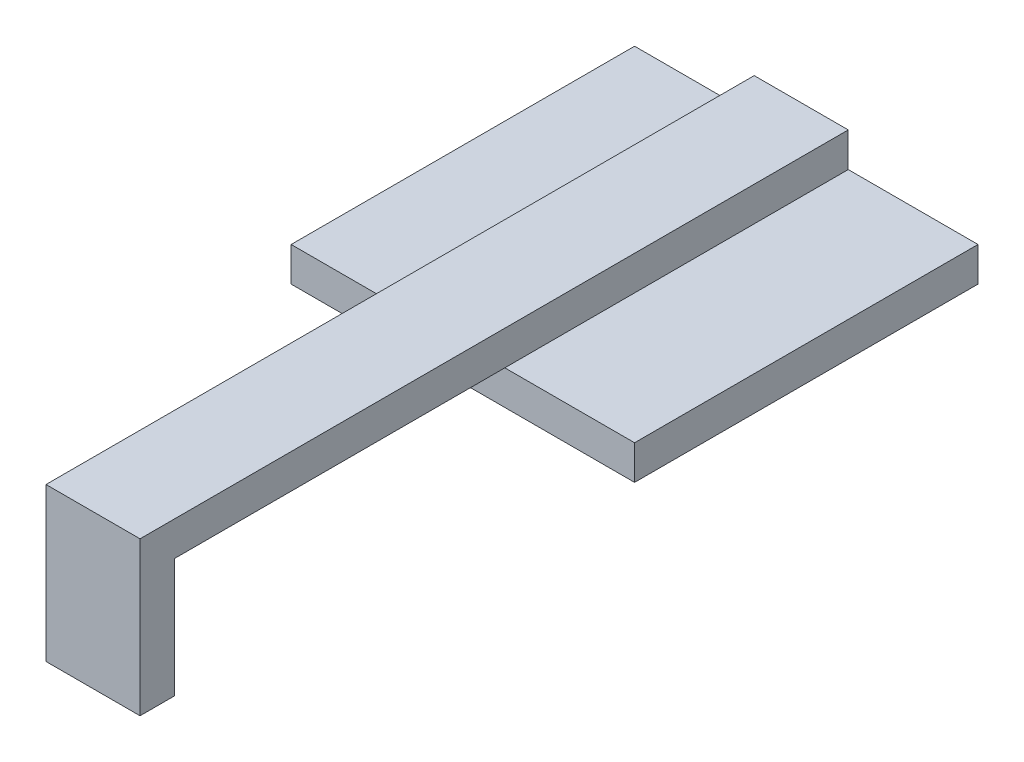
ISO-10303-21;
HEADER;
FILE_DESCRIPTION(('STEP AP214'),'2;1');
FILE_NAME('part.step','',(''),(''),'','','');
FILE_SCHEMA(('AUTOMOTIVE_DESIGN { 1 0 10303 214 1 1 1 1 }'));
ENDSEC;
DATA;
#1=APPLICATION_CONTEXT('core data for automotive mechanical design processes');
#2=APPLICATION_PROTOCOL_DEFINITION('international standard','automotive_design',2000,#1);
#3=PRODUCT_CONTEXT('',#1,'mechanical');
#4=PRODUCT('Part','Part','',(#3));
#5=PRODUCT_RELATED_PRODUCT_CATEGORY('part','',(#4));
#6=PRODUCT_DEFINITION_FORMATION('','',#4);
#7=PRODUCT_DEFINITION_CONTEXT('part definition',#1,'design');
#8=PRODUCT_DEFINITION('design','',#6,#7);
#9=PRODUCT_DEFINITION_SHAPE('','',#8);
#10=(LENGTH_UNIT() NAMED_UNIT(*) SI_UNIT(.MILLI.,.METRE.));
#11=(NAMED_UNIT(*) PLANE_ANGLE_UNIT() SI_UNIT($,.RADIAN.));
#12=(NAMED_UNIT(*) SI_UNIT($,.STERADIAN.) SOLID_ANGLE_UNIT());
#13=UNCERTAINTY_MEASURE_WITH_UNIT(LENGTH_MEASURE(1.E-05),#10,'distance_accuracy_value','');
#14=(GEOMETRIC_REPRESENTATION_CONTEXT(3) GLOBAL_UNCERTAINTY_ASSIGNED_CONTEXT((#13)) GLOBAL_UNIT_ASSIGNED_CONTEXT((#10,
#11,#12)) REPRESENTATION_CONTEXT('',''));
#15=CARTESIAN_POINT('',(0.,0.,0.));
#16=DIRECTION('',(0.,0.,1.));
#17=DIRECTION('',(1.,0.,0.));
#18=AXIS2_PLACEMENT_3D('',#15,#16,#17);
#19=CARTESIAN_POINT('',(0.,3.,0.));
#20=DIRECTION('',(0.,1.,0.));
#21=DIRECTION('',(0.,0.,1.));
#22=AXIS2_PLACEMENT_3D('',#19,#20,#21);
#23=PLANE('',#22);
#24=DIRECTION('',(0.,0.,1.));
#25=VECTOR('',#24,1.);
#26=CARTESIAN_POINT('',(-4.54924775272047,3.,-15.));
#27=LINE('',#26,#25);
#28=CARTESIAN_POINT('',(-4.54924775272047,3.,-15.));
#29=VERTEX_POINT('',#28);
#30=CARTESIAN_POINT('',(-4.54924775272047,3.,15.));
#31=VERTEX_POINT('',#30);
#32=EDGE_CURVE('E146',#29,#31,#27,.T.);
#33=ORIENTED_EDGE('',*,*,#32,.F.);
#34=DIRECTION('',(-1.,0.,0.));
#35=VECTOR('',#34,1.);
#36=CARTESIAN_POINT('',(-15.,3.,-15.));
#37=LINE('',#36,#35);
#38=CARTESIAN_POINT('',(-15.,3.,-15.));
#39=VERTEX_POINT('',#38);
#40=EDGE_CURVE('E188',#29,#39,#37,.T.);
#41=ORIENTED_EDGE('',*,*,#40,.T.);
#42=DIRECTION('',(0.,0.,1.));
#43=VECTOR('',#42,1.);
#44=CARTESIAN_POINT('',(-15.,3.,-15.));
#45=LINE('',#44,#43);
#46=CARTESIAN_POINT('',(-15.,3.,15.));
#47=VERTEX_POINT('',#46);
#48=EDGE_CURVE('E216',#39,#47,#45,.T.);
#49=ORIENTED_EDGE('',*,*,#48,.T.);
#50=DIRECTION('',(1.,0.,0.));
#51=VECTOR('',#50,1.);
#52=CARTESIAN_POINT('',(-15.,3.,15.));
#53=LINE('',#52,#51);
#54=EDGE_CURVE('E234',#47,#31,#53,.T.);
#55=ORIENTED_EDGE('',*,*,#54,.T.);
#56=EDGE_LOOP('',(#33,#41,#49,#55));
#57=FACE_BOUND('',#56,.T.);
#58=ADVANCED_FACE('F33',(#57),#23,.T.);
#59=CARTESIAN_POINT('',(15.,3.,-15.));
#60=DIRECTION('',(-1.,0.,0.));
#61=DIRECTION('',(0.,0.,1.));
#62=AXIS2_PLACEMENT_3D('',#59,#60,#61);
#63=PLANE('',#62);
#64=DIRECTION('',(0.,0.,-1.));
#65=VECTOR('',#64,1.);
#66=CARTESIAN_POINT('',(15.,0.,-15.));
#67=LINE('',#66,#65);
#68=CARTESIAN_POINT('',(15.,0.,15.));
#69=VERTEX_POINT('',#68);
#70=CARTESIAN_POINT('',(15.,0.,-15.));
#71=VERTEX_POINT('',#70);
#72=EDGE_CURVE('E193',#69,#71,#67,.T.);
#73=ORIENTED_EDGE('',*,*,#72,.T.);
#74=DIRECTION('',(0.,-1.,0.));
#75=VECTOR('',#74,1.);
#76=CARTESIAN_POINT('',(15.,3.,-15.));
#77=LINE('',#76,#75);
#78=CARTESIAN_POINT('',(15.,3.,-15.));
#79=VERTEX_POINT('',#78);
#80=EDGE_CURVE('E43',#79,#71,#77,.T.);
#81=ORIENTED_EDGE('',*,*,#80,.F.);
#82=DIRECTION('',(0.,0.,-1.));
#83=VECTOR('',#82,1.);
#84=CARTESIAN_POINT('',(15.,3.,-15.));
#85=LINE('',#84,#83);
#86=CARTESIAN_POINT('',(15.,3.,15.));
#87=VERTEX_POINT('',#86);
#88=EDGE_CURVE('E183',#87,#79,#85,.T.);
#89=ORIENTED_EDGE('',*,*,#88,.F.);
#90=DIRECTION('',(0.,-1.,0.));
#91=VECTOR('',#90,1.);
#92=CARTESIAN_POINT('',(15.,3.,15.));
#93=LINE('',#92,#91);
#94=EDGE_CURVE('E231',#87,#69,#93,.T.);
#95=ORIENTED_EDGE('',*,*,#94,.T.);
#96=EDGE_LOOP('',(#73,#81,#89,#95));
#97=FACE_BOUND('',#96,.T.);
#98=ADVANCED_FACE('F35',(#97),#63,.F.);
#99=CARTESIAN_POINT('',(-15.,3.,-15.));
#100=DIRECTION('',(0.,0.,1.));
#101=DIRECTION('',(1.,0.,0.));
#102=AXIS2_PLACEMENT_3D('',#99,#100,#101);
#103=PLANE('',#102);
#104=DIRECTION('',(-1.,0.,0.));
#105=VECTOR('',#104,1.);
#106=CARTESIAN_POINT('',(-15.,0.,-15.));
#107=LINE('',#106,#105);
#108=CARTESIAN_POINT('',(-15.,0.,-15.));
#109=VERTEX_POINT('',#108);
#110=EDGE_CURVE('E227',#71,#109,#107,.T.);
#111=ORIENTED_EDGE('',*,*,#110,.T.);
#112=DIRECTION('',(0.,-1.,0.));
#113=VECTOR('',#112,1.);
#114=CARTESIAN_POINT('',(-15.,3.,-15.));
#115=LINE('',#114,#113);
#116=EDGE_CURVE('E212',#39,#109,#115,.T.);
#117=ORIENTED_EDGE('',*,*,#116,.F.);
#118=ORIENTED_EDGE('',*,*,#40,.F.);
#119=DIRECTION('',(0.,-1.,0.));
#120=VECTOR('',#119,1.);
#121=CARTESIAN_POINT('',(-4.54924775272047,6.,-15.));
#122=LINE('',#121,#120);
#123=CARTESIAN_POINT('',(-4.54924775272047,6.,-15.));
#124=VERTEX_POINT('',#123);
#125=EDGE_CURVE('E194',#124,#29,#122,.T.);
#126=ORIENTED_EDGE('',*,*,#125,.F.);
#127=DIRECTION('',(-1.,0.,0.));
#128=VECTOR('',#127,1.);
#129=CARTESIAN_POINT('',(-4.54924775272047,6.,-15.));
#130=LINE('',#129,#128);
#131=CARTESIAN_POINT('',(3.66528583998615,6.,-15.));
#132=VERTEX_POINT('',#131);
#133=EDGE_CURVE('E198',#132,#124,#130,.T.);
#134=ORIENTED_EDGE('',*,*,#133,.F.);
#135=DIRECTION('',(0.,-1.,0.));
#136=VECTOR('',#135,1.);
#137=CARTESIAN_POINT('',(3.66528583998615,6.,-15.));
#138=LINE('',#137,#136);
#139=CARTESIAN_POINT('',(3.66528583998615,3.,-15.));
#140=VERTEX_POINT('',#139);
#141=EDGE_CURVE('E190',#132,#140,#138,.T.);
#142=ORIENTED_EDGE('',*,*,#141,.T.);
#143=EDGE_CURVE('E215',#79,#140,#37,.T.);
#144=ORIENTED_EDGE('',*,*,#143,.F.);
#145=ORIENTED_EDGE('',*,*,#80,.T.);
#146=EDGE_LOOP('',(#111,#117,#118,#126,#134,#142,#144,#145));
#147=FACE_BOUND('',#146,.T.);
#148=ADVANCED_FACE('F208',(#147),#103,.F.);
#149=CARTESIAN_POINT('',(-15.,3.,-15.));
#150=DIRECTION('',(1.,0.,0.));
#151=DIRECTION('',(0.,0.,-1.));
#152=AXIS2_PLACEMENT_3D('',#149,#150,#151);
#153=PLANE('',#152);
#154=DIRECTION('',(0.,0.,1.));
#155=VECTOR('',#154,1.);
#156=CARTESIAN_POINT('',(-15.,0.,-15.));
#157=LINE('',#156,#155);
#158=CARTESIAN_POINT('',(-15.,0.,15.));
#159=VERTEX_POINT('',#158);
#160=EDGE_CURVE('E221',#109,#159,#157,.T.);
#161=ORIENTED_EDGE('',*,*,#160,.T.);
#162=DIRECTION('',(0.,-1.,0.));
#163=VECTOR('',#162,1.);
#164=CARTESIAN_POINT('',(-15.,3.,15.));
#165=LINE('',#164,#163);
#166=EDGE_CURVE('E233',#47,#159,#165,.T.);
#167=ORIENTED_EDGE('',*,*,#166,.F.);
#168=ORIENTED_EDGE('',*,*,#48,.F.);
#169=ORIENTED_EDGE('',*,*,#116,.T.);
#170=EDGE_LOOP('',(#161,#167,#168,#169));
#171=FACE_BOUND('',#170,.T.);
#172=ADVANCED_FACE('F249',(#171),#153,.F.);
#173=CARTESIAN_POINT('',(-15.,3.,15.));
#174=DIRECTION('',(0.,0.,-1.));
#175=DIRECTION('',(-1.,0.,0.));
#176=AXIS2_PLACEMENT_3D('',#173,#174,#175);
#177=PLANE('',#176);
#178=DIRECTION('',(1.,0.,0.));
#179=VECTOR('',#178,1.);
#180=CARTESIAN_POINT('',(-15.,0.,15.));
#181=LINE('',#180,#179);
#182=EDGE_CURVE('E218',#159,#69,#181,.T.);
#183=ORIENTED_EDGE('',*,*,#182,.T.);
#184=ORIENTED_EDGE('',*,*,#94,.F.);
#185=CARTESIAN_POINT('',(3.66528583998615,3.,15.));
#186=VERTEX_POINT('',#185);
#187=EDGE_CURVE('E242',#186,#87,#53,.T.);
#188=ORIENTED_EDGE('',*,*,#187,.F.);
#189=EDGE_CURVE('E56',#31,#186,#53,.T.);
#190=ORIENTED_EDGE('',*,*,#189,.F.);
#191=ORIENTED_EDGE('',*,*,#54,.F.);
#192=ORIENTED_EDGE('',*,*,#166,.T.);
#193=EDGE_LOOP('',(#183,#184,#188,#190,#191,#192));
#194=FACE_BOUND('',#193,.T.);
#195=ADVANCED_FACE('F253',(#194),#177,.F.);
#196=DIRECTION('',(0.,0.,-1.));
#197=VECTOR('',#196,1.);
#198=CARTESIAN_POINT('',(3.66528583998615,3.,-15.));
#199=LINE('',#198,#197);
#200=EDGE_CURVE('E11',#186,#140,#199,.T.);
#201=ORIENTED_EDGE('',*,*,#200,.F.);
#202=ORIENTED_EDGE('',*,*,#187,.T.);
#203=ORIENTED_EDGE('',*,*,#88,.T.);
#204=ORIENTED_EDGE('',*,*,#143,.T.);
#205=EDGE_LOOP('',(#201,#202,#203,#204));
#206=FACE_BOUND('',#205,.T.);
#207=ADVANCED_FACE('F257',(#206),#23,.T.);
#208=CARTESIAN_POINT('',(0.,0.,0.));
#209=DIRECTION('',(0.,1.,0.));
#210=DIRECTION('',(0.,0.,1.));
#211=AXIS2_PLACEMENT_3D('',#208,#209,#210);
#212=PLANE('',#211);
#213=ORIENTED_EDGE('',*,*,#72,.F.);
#214=ORIENTED_EDGE('',*,*,#182,.F.);
#215=ORIENTED_EDGE('',*,*,#160,.F.);
#216=ORIENTED_EDGE('',*,*,#110,.F.);
#217=EDGE_LOOP('',(#213,#214,#215,#216));
#218=FACE_BOUND('',#217,.T.);
#219=ADVANCED_FACE('F251',(#218),#212,.F.);
#220=CARTESIAN_POINT('',(0.,3.,0.));
#221=DIRECTION('',(0.,1.,0.));
#222=DIRECTION('',(0.,0.,1.));
#223=AXIS2_PLACEMENT_3D('',#220,#221,#222);
#224=PLANE('',#223);
#225=CARTESIAN_POINT('',(-4.54924775272047,3.,43.8666865730397));
#226=VERTEX_POINT('',#225);
#227=EDGE_CURVE('E37',#31,#226,#27,.T.);
#228=ORIENTED_EDGE('',*,*,#227,.F.);
#229=ORIENTED_EDGE('',*,*,#189,.T.);
#230=CARTESIAN_POINT('',(3.66528583998615,3.,43.8666865730397));
#231=VERTEX_POINT('',#230);
#232=EDGE_CURVE('E164',#231,#186,#199,.T.);
#233=ORIENTED_EDGE('',*,*,#232,.F.);
#234=DIRECTION('',(1.,0.,0.));
#235=VECTOR('',#234,1.);
#236=CARTESIAN_POINT('',(-4.54924775272047,3.,43.8666865730397));
#237=LINE('',#236,#235);
#238=EDGE_CURVE('E169',#226,#231,#237,.T.);
#239=ORIENTED_EDGE('',*,*,#238,.F.);
#240=EDGE_LOOP('',(#228,#229,#233,#239));
#241=FACE_BOUND('',#240,.T.);
#242=ADVANCED_FACE('F254',(#241),#224,.F.);
#243=CARTESIAN_POINT('',(-4.54924775272047,6.,-15.));
#244=DIRECTION('',(1.,0.,0.));
#245=DIRECTION('',(0.,0.,-1.));
#246=AXIS2_PLACEMENT_3D('',#243,#244,#245);
#247=PLANE('',#246);
#248=ORIENTED_EDGE('',*,*,#32,.T.);
#249=ORIENTED_EDGE('',*,*,#227,.T.);
#250=DIRECTION('',(0.,-1.,0.));
#251=VECTOR('',#250,1.);
#252=CARTESIAN_POINT('',(-4.54924775272047,6.,43.8666865730397));
#253=LINE('',#252,#251);
#254=CARTESIAN_POINT('',(-4.54924775272047,-7.39178696180431,43.8666865730397));
#255=VERTEX_POINT('',#254);
#256=EDGE_CURVE('E143',#226,#255,#253,.T.);
#257=ORIENTED_EDGE('',*,*,#256,.T.);
#258=DIRECTION('',(0.,0.,-1.));
#259=VECTOR('',#258,1.);
#260=CARTESIAN_POINT('',(-4.54924775272047,-7.39178696180431,46.8666865730397));
#261=LINE('',#260,#259);
#262=CARTESIAN_POINT('',(-4.54924775272047,-7.39178696180431,46.8666865730397));
#263=VERTEX_POINT('',#262);
#264=EDGE_CURVE('E122',#263,#255,#261,.T.);
#265=ORIENTED_EDGE('',*,*,#264,.F.);
#266=DIRECTION('',(0.,-1.,0.));
#267=VECTOR('',#266,1.);
#268=CARTESIAN_POINT('',(-4.54924775272047,6.,46.8666865730397));
#269=LINE('',#268,#267);
#270=CARTESIAN_POINT('',(-4.54924775272047,6.,46.8666865730397));
#271=VERTEX_POINT('',#270);
#272=EDGE_CURVE('E129',#271,#263,#269,.T.);
#273=ORIENTED_EDGE('',*,*,#272,.F.);
#274=DIRECTION('',(0.,0.,1.));
#275=VECTOR('',#274,1.);
#276=CARTESIAN_POINT('',(-4.54924775272047,6.,-15.));
#277=LINE('',#276,#275);
#278=EDGE_CURVE('E172',#124,#271,#277,.T.);
#279=ORIENTED_EDGE('',*,*,#278,.F.);
#280=ORIENTED_EDGE('',*,*,#125,.T.);
#281=EDGE_LOOP('',(#248,#249,#257,#265,#273,#279,#280));
#282=FACE_BOUND('',#281,.T.);
#283=ADVANCED_FACE('F141',(#282),#247,.F.);
#284=CARTESIAN_POINT('',(3.66528583998615,6.,-15.));
#285=DIRECTION('',(-1.,0.,0.));
#286=DIRECTION('',(0.,0.,1.));
#287=AXIS2_PLACEMENT_3D('',#284,#285,#286);
#288=PLANE('',#287);
#289=ORIENTED_EDGE('',*,*,#232,.T.);
#290=ORIENTED_EDGE('',*,*,#200,.T.);
#291=ORIENTED_EDGE('',*,*,#141,.F.);
#292=DIRECTION('',(0.,0.,-1.));
#293=VECTOR('',#292,1.);
#294=CARTESIAN_POINT('',(3.66528583998615,6.,-15.));
#295=LINE('',#294,#293);
#296=CARTESIAN_POINT('',(3.66528583998615,6.,46.8666865730397));
#297=VERTEX_POINT('',#296);
#298=EDGE_CURVE('E201',#297,#132,#295,.T.);
#299=ORIENTED_EDGE('',*,*,#298,.F.);
#300=DIRECTION('',(0.,1.,0.));
#301=VECTOR('',#300,1.);
#302=CARTESIAN_POINT('',(3.66528583998615,6.,46.8666865730397));
#303=LINE('',#302,#301);
#304=CARTESIAN_POINT('',(3.66528583998616,-7.39178696180431,46.8666865730397));
#305=VERTEX_POINT('',#304);
#306=EDGE_CURVE('E128',#305,#297,#303,.T.);
#307=ORIENTED_EDGE('',*,*,#306,.F.);
#308=DIRECTION('',(0.,0.,-1.));
#309=VECTOR('',#308,1.);
#310=CARTESIAN_POINT('',(3.66528583998616,-7.39178696180431,46.8666865730397));
#311=LINE('',#310,#309);
#312=CARTESIAN_POINT('',(3.66528583998616,-7.39178696180431,43.8666865730397));
#313=VERTEX_POINT('',#312);
#314=EDGE_CURVE('E124',#305,#313,#311,.T.);
#315=ORIENTED_EDGE('',*,*,#314,.T.);
#316=DIRECTION('',(0.,1.,0.));
#317=VECTOR('',#316,1.);
#318=CARTESIAN_POINT('',(3.66528583998615,6.,43.8666865730397));
#319=LINE('',#318,#317);
#320=EDGE_CURVE('E138',#313,#231,#319,.T.);
#321=ORIENTED_EDGE('',*,*,#320,.T.);
#322=EDGE_LOOP('',(#289,#290,#291,#299,#307,#315,#321));
#323=FACE_BOUND('',#322,.T.);
#324=ADVANCED_FACE('F163',(#323),#288,.F.);
#325=CARTESIAN_POINT('',(0.,6.,0.));
#326=DIRECTION('',(0.,1.,0.));
#327=DIRECTION('',(0.,0.,1.));
#328=AXIS2_PLACEMENT_3D('',#325,#326,#327);
#329=PLANE('',#328);
#330=ORIENTED_EDGE('',*,*,#278,.T.);
#331=DIRECTION('',(-1.,0.,0.));
#332=VECTOR('',#331,1.);
#333=CARTESIAN_POINT('',(-4.54924775272047,6.,46.8666865730397));
#334=LINE('',#333,#332);
#335=EDGE_CURVE('E135',#297,#271,#334,.T.);
#336=ORIENTED_EDGE('',*,*,#335,.F.);
#337=ORIENTED_EDGE('',*,*,#298,.T.);
#338=ORIENTED_EDGE('',*,*,#133,.T.);
#339=EDGE_LOOP('',(#330,#336,#337,#338));
#340=FACE_BOUND('',#339,.T.);
#341=ADVANCED_FACE('F205',(#340),#329,.T.);
#342=CARTESIAN_POINT('',(0.,0.,43.8666865730397));
#343=DIRECTION('',(0.,0.,1.));
#344=DIRECTION('',(1.,0.,0.));
#345=AXIS2_PLACEMENT_3D('',#342,#343,#344);
#346=PLANE('',#345);
#347=ORIENTED_EDGE('',*,*,#256,.F.);
#348=ORIENTED_EDGE('',*,*,#238,.T.);
#349=ORIENTED_EDGE('',*,*,#320,.F.);
#350=DIRECTION('',(1.,0.,0.));
#351=VECTOR('',#350,1.);
#352=CARTESIAN_POINT('',(-4.54924775272047,-7.39178696180431,43.8666865730397));
#353=LINE('',#352,#351);
#354=EDGE_CURVE('E152',#255,#313,#353,.T.);
#355=ORIENTED_EDGE('',*,*,#354,.F.);
#356=EDGE_LOOP('',(#347,#348,#349,#355));
#357=FACE_BOUND('',#356,.T.);
#358=ADVANCED_FACE('F167',(#357),#346,.F.);
#359=CARTESIAN_POINT('',(-4.54924775272047,-7.39178696180431,46.8666865730397));
#360=DIRECTION('',(0.,1.,0.));
#361=DIRECTION('',(0.,0.,1.));
#362=AXIS2_PLACEMENT_3D('',#359,#360,#361);
#363=PLANE('',#362);
#364=ORIENTED_EDGE('',*,*,#354,.T.);
#365=ORIENTED_EDGE('',*,*,#314,.F.);
#366=DIRECTION('',(1.,0.,0.));
#367=VECTOR('',#366,1.);
#368=CARTESIAN_POINT('',(-4.54924775272047,-7.39178696180431,46.8666865730397));
#369=LINE('',#368,#367);
#370=EDGE_CURVE('E118',#263,#305,#369,.T.);
#371=ORIENTED_EDGE('',*,*,#370,.F.);
#372=ORIENTED_EDGE('',*,*,#264,.T.);
#373=EDGE_LOOP('',(#364,#365,#371,#372));
#374=FACE_BOUND('',#373,.T.);
#375=ADVANCED_FACE('F120',(#374),#363,.F.);
#376=CARTESIAN_POINT('',(0.,0.,46.8666865730397));
#377=DIRECTION('',(0.,0.,1.));
#378=DIRECTION('',(1.,0.,0.));
#379=AXIS2_PLACEMENT_3D('',#376,#377,#378);
#380=PLANE('',#379);
#381=ORIENTED_EDGE('',*,*,#272,.T.);
#382=ORIENTED_EDGE('',*,*,#370,.T.);
#383=ORIENTED_EDGE('',*,*,#306,.T.);
#384=ORIENTED_EDGE('',*,*,#335,.T.);
#385=EDGE_LOOP('',(#381,#382,#383,#384));
#386=FACE_BOUND('',#385,.T.);
#387=ADVANCED_FACE('F133',(#386),#380,.T.);
#388=CLOSED_SHELL('',(#58,#98,#148,#172,#195,#207,#219,#242,#283,#324,#341,#358,#375,#387));
#389=MANIFOLD_SOLID_BREP('B2',#388);
#390=ADVANCED_BREP_SHAPE_REPRESENTATION('',(#18,#389),#14);
#391=SHAPE_DEFINITION_REPRESENTATION(#9,#390);
ENDSEC;
END-ISO-10303-21;
